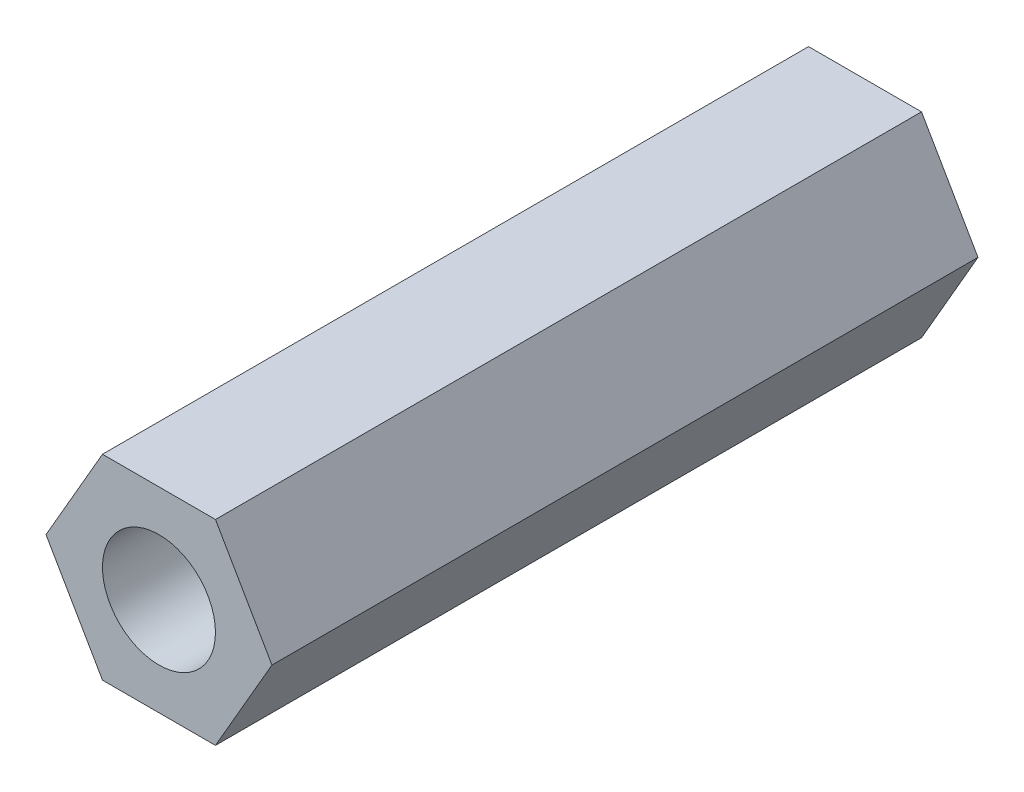
ISO-10303-21;
HEADER;
FILE_DESCRIPTION(('STEP AP214'),'2;1');
FILE_NAME('part.step','',(''),(''),'','','');
FILE_SCHEMA(('AUTOMOTIVE_DESIGN { 1 0 10303 214 1 1 1 1 }'));
ENDSEC;
DATA;
#1=APPLICATION_CONTEXT('core data for automotive mechanical design processes');
#2=APPLICATION_PROTOCOL_DEFINITION('international standard','automotive_design',2000,#1);
#3=PRODUCT_CONTEXT('',#1,'mechanical');
#4=PRODUCT('Part','Part','',(#3));
#5=PRODUCT_RELATED_PRODUCT_CATEGORY('part','',(#4));
#6=PRODUCT_DEFINITION_FORMATION('','',#4);
#7=PRODUCT_DEFINITION_CONTEXT('part definition',#1,'design');
#8=PRODUCT_DEFINITION('design','',#6,#7);
#9=PRODUCT_DEFINITION_SHAPE('','',#8);
#10=(LENGTH_UNIT() NAMED_UNIT(*) SI_UNIT(.MILLI.,.METRE.));
#11=(NAMED_UNIT(*) PLANE_ANGLE_UNIT() SI_UNIT($,.RADIAN.));
#12=(NAMED_UNIT(*) SI_UNIT($,.STERADIAN.) SOLID_ANGLE_UNIT());
#13=UNCERTAINTY_MEASURE_WITH_UNIT(LENGTH_MEASURE(1.E-05),#10,'distance_accuracy_value','');
#14=(GEOMETRIC_REPRESENTATION_CONTEXT(3) GLOBAL_UNCERTAINTY_ASSIGNED_CONTEXT((#13)) GLOBAL_UNIT_ASSIGNED_CONTEXT((#10,
#11,#12)) REPRESENTATION_CONTEXT('',''));
#15=CARTESIAN_POINT('',(0.,0.,0.));
#16=DIRECTION('',(0.,0.,1.));
#17=DIRECTION('',(1.,0.,0.));
#18=AXIS2_PLACEMENT_3D('',#15,#16,#17);
#19=CARTESIAN_POINT('',(0.,0.,25.));
#20=DIRECTION('',(0.,0.,1.));
#21=DIRECTION('',(1.,0.,0.));
#22=AXIS2_PLACEMENT_3D('',#19,#20,#21);
#23=PLANE('',#22);
#24=DIRECTION('',(0.499999999999994,0.866025403784442,0.));
#25=VECTOR('',#24,1.);
#26=CARTESIAN_POINT('',(47.1306074453142,75.903097182219,25.));
#27=LINE('',#26,#25);
#28=CARTESIAN_POINT('',(47.1306074453142,75.903097182219,25.));
#29=VERTEX_POINT('',#28);
#30=CARTESIAN_POINT('',(49.1306074453142,79.3671987973568,25.));
#31=VERTEX_POINT('',#30);
#32=EDGE_CURVE('E131',#29,#31,#27,.T.);
#33=ORIENTED_EDGE('',*,*,#32,.T.);
#34=DIRECTION('',(-0.499999999999999,0.866025403784439,0.));
#35=VECTOR('',#34,1.);
#36=CARTESIAN_POINT('',(49.1306074453142,79.3671987973568,25.));
#37=LINE('',#36,#35);
#38=CARTESIAN_POINT('',(47.1306074453142,82.8313004124945,25.));
#39=VERTEX_POINT('',#38);
#40=EDGE_CURVE('E89',#31,#39,#37,.T.);
#41=ORIENTED_EDGE('',*,*,#40,.T.);
#42=DIRECTION('',(-1.,0.,0.));
#43=VECTOR('',#42,1.);
#44=CARTESIAN_POINT('',(47.1306074453142,82.8313004124945,25.));
#45=LINE('',#44,#43);
#46=CARTESIAN_POINT('',(43.1306074453142,82.8313004124945,25.));
#47=VERTEX_POINT('',#46);
#48=EDGE_CURVE('E102',#39,#47,#45,.T.);
#49=ORIENTED_EDGE('',*,*,#48,.T.);
#50=DIRECTION('',(-0.5,-0.866025403784438,0.));
#51=VECTOR('',#50,1.);
#52=CARTESIAN_POINT('',(43.1306074453142,82.8313004124945,25.));
#53=LINE('',#52,#51);
#54=CARTESIAN_POINT('',(41.1306074453142,79.3671987973568,25.));
#55=VERTEX_POINT('',#54);
#56=EDGE_CURVE('E96',#47,#55,#53,.T.);
#57=ORIENTED_EDGE('',*,*,#56,.T.);
#58=DIRECTION('',(0.5,-0.866025403784438,0.));
#59=VECTOR('',#58,1.);
#60=CARTESIAN_POINT('',(41.1306074453142,79.3671987973568,25.));
#61=LINE('',#60,#59);
#62=CARTESIAN_POINT('',(43.1306074453142,75.903097182219,25.));
#63=VERTEX_POINT('',#62);
#64=EDGE_CURVE('E100',#55,#63,#61,.T.);
#65=ORIENTED_EDGE('',*,*,#64,.T.);
#66=DIRECTION('',(1.,0.,0.));
#67=VECTOR('',#66,1.);
#68=CARTESIAN_POINT('',(43.1306074453142,75.903097182219,25.));
#69=LINE('',#68,#67);
#70=EDGE_CURVE('E52',#63,#29,#69,.T.);
#71=ORIENTED_EDGE('',*,*,#70,.T.);
#72=EDGE_LOOP('',(#33,#41,#49,#57,#65,#71));
#73=FACE_BOUND('',#72,.T.);
#74=CARTESIAN_POINT('',(45.1306074453142,79.3671987973568,25.));
#75=DIRECTION('',(0.,0.,1.));
#76=DIRECTION('',(1.,0.,0.));
#77=AXIS2_PLACEMENT_3D('',#74,#75,#76);
#78=CIRCLE('',#77,2.);
#79=CARTESIAN_POINT('',(47.1306074453142,79.3671987973568,25.));
#80=VERTEX_POINT('',#79);
#81=EDGE_CURVE('E124',#80,#80,#78,.T.);
#82=ORIENTED_EDGE('',*,*,#81,.F.);
#83=EDGE_LOOP('',(#82));
#84=FACE_BOUND('',#83,.T.);
#85=ADVANCED_FACE('F35',(#73,#84),#23,.T.);
#86=CARTESIAN_POINT('',(0.,0.,0.));
#87=DIRECTION('',(0.,0.,1.));
#88=DIRECTION('',(1.,0.,0.));
#89=AXIS2_PLACEMENT_3D('',#86,#87,#88);
#90=PLANE('',#89);
#91=DIRECTION('',(0.499999999999994,0.866025403784442,0.));
#92=VECTOR('',#91,1.);
#93=CARTESIAN_POINT('',(47.1306074453142,75.903097182219,0.));
#94=LINE('',#93,#92);
#95=CARTESIAN_POINT('',(47.1306074453142,75.903097182219,0.));
#96=VERTEX_POINT('',#95);
#97=CARTESIAN_POINT('',(49.1306074453142,79.3671987973568,0.));
#98=VERTEX_POINT('',#97);
#99=EDGE_CURVE('E120',#96,#98,#94,.T.);
#100=ORIENTED_EDGE('',*,*,#99,.F.);
#101=DIRECTION('',(1.,0.,0.));
#102=VECTOR('',#101,1.);
#103=CARTESIAN_POINT('',(43.1306074453142,75.903097182219,0.));
#104=LINE('',#103,#102);
#105=CARTESIAN_POINT('',(43.1306074453142,75.903097182219,0.));
#106=VERTEX_POINT('',#105);
#107=EDGE_CURVE('E81',#106,#96,#104,.T.);
#108=ORIENTED_EDGE('',*,*,#107,.F.);
#109=DIRECTION('',(0.5,-0.866025403784438,0.));
#110=VECTOR('',#109,1.);
#111=CARTESIAN_POINT('',(41.1306074453142,79.3671987973568,0.));
#112=LINE('',#111,#110);
#113=CARTESIAN_POINT('',(41.1306074453142,79.3671987973568,0.));
#114=VERTEX_POINT('',#113);
#115=EDGE_CURVE('E75',#114,#106,#112,.T.);
#116=ORIENTED_EDGE('',*,*,#115,.F.);
#117=DIRECTION('',(-0.5,-0.866025403784438,0.));
#118=VECTOR('',#117,1.);
#119=CARTESIAN_POINT('',(43.1306074453142,82.8313004124945,0.));
#120=LINE('',#119,#118);
#121=CARTESIAN_POINT('',(43.1306074453142,82.8313004124945,0.));
#122=VERTEX_POINT('',#121);
#123=EDGE_CURVE('E110',#122,#114,#120,.T.);
#124=ORIENTED_EDGE('',*,*,#123,.F.);
#125=DIRECTION('',(-1.,0.,0.));
#126=VECTOR('',#125,1.);
#127=CARTESIAN_POINT('',(47.1306074453142,82.8313004124945,0.));
#128=LINE('',#127,#126);
#129=CARTESIAN_POINT('',(47.1306074453142,82.8313004124945,0.));
#130=VERTEX_POINT('',#129);
#131=EDGE_CURVE('E126',#130,#122,#128,.T.);
#132=ORIENTED_EDGE('',*,*,#131,.F.);
#133=DIRECTION('',(-0.499999999999999,0.866025403784439,0.));
#134=VECTOR('',#133,1.);
#135=CARTESIAN_POINT('',(49.1306074453142,79.3671987973568,0.));
#136=LINE('',#135,#134);
#137=EDGE_CURVE('E123',#98,#130,#136,.T.);
#138=ORIENTED_EDGE('',*,*,#137,.F.);
#139=EDGE_LOOP('',(#100,#108,#116,#124,#132,#138));
#140=FACE_BOUND('',#139,.T.);
#141=CARTESIAN_POINT('',(45.1306074453142,79.3671987973568,0.));
#142=DIRECTION('',(0.,0.,1.));
#143=DIRECTION('',(1.,0.,0.));
#144=AXIS2_PLACEMENT_3D('',#141,#142,#143);
#145=CIRCLE('',#144,2.);
#146=CARTESIAN_POINT('',(47.1306074453142,79.3671987973568,0.));
#147=VERTEX_POINT('',#146);
#148=EDGE_CURVE('E224',#147,#147,#145,.T.);
#149=ORIENTED_EDGE('',*,*,#148,.T.);
#150=EDGE_LOOP('',(#149));
#151=FACE_BOUND('',#150,.T.);
#152=ADVANCED_FACE('F140',(#140,#151),#90,.F.);
#153=CARTESIAN_POINT('',(47.1306074453142,75.903097182219,25.));
#154=DIRECTION('',(-0.866025403784442,0.499999999999994,0.));
#155=DIRECTION('',(-0.499999999999994,-0.866025403784442,0.));
#156=AXIS2_PLACEMENT_3D('',#153,#154,#155);
#157=PLANE('',#156);
#158=ORIENTED_EDGE('',*,*,#99,.T.);
#159=DIRECTION('',(0.,0.,-1.));
#160=VECTOR('',#159,1.);
#161=CARTESIAN_POINT('',(49.1306074453142,79.3671987973568,25.));
#162=LINE('',#161,#160);
#163=EDGE_CURVE('E11',#31,#98,#162,.T.);
#164=ORIENTED_EDGE('',*,*,#163,.F.);
#165=ORIENTED_EDGE('',*,*,#32,.F.);
#166=DIRECTION('',(0.,0.,-1.));
#167=VECTOR('',#166,1.);
#168=CARTESIAN_POINT('',(47.1306074453142,75.903097182219,25.));
#169=LINE('',#168,#167);
#170=EDGE_CURVE('E116',#29,#96,#169,.T.);
#171=ORIENTED_EDGE('',*,*,#170,.T.);
#172=EDGE_LOOP('',(#158,#164,#165,#171));
#173=FACE_BOUND('',#172,.T.);
#174=ADVANCED_FACE('F37',(#173),#157,.F.);
#175=CARTESIAN_POINT('',(49.1306074453142,79.3671987973568,25.));
#176=DIRECTION('',(-0.866025403784439,-0.499999999999999,0.));
#177=DIRECTION('',(0.499999999999999,-0.866025403784439,0.));
#178=AXIS2_PLACEMENT_3D('',#175,#176,#177);
#179=PLANE('',#178);
#180=ORIENTED_EDGE('',*,*,#137,.T.);
#181=DIRECTION('',(0.,0.,-1.));
#182=VECTOR('',#181,1.);
#183=CARTESIAN_POINT('',(47.1306074453142,82.8313004124945,25.));
#184=LINE('',#183,#182);
#185=EDGE_CURVE('E44',#39,#130,#184,.T.);
#186=ORIENTED_EDGE('',*,*,#185,.F.);
#187=ORIENTED_EDGE('',*,*,#40,.F.);
#188=ORIENTED_EDGE('',*,*,#163,.T.);
#189=EDGE_LOOP('',(#180,#186,#187,#188));
#190=FACE_BOUND('',#189,.T.);
#191=ADVANCED_FACE('F165',(#190),#179,.F.);
#192=CARTESIAN_POINT('',(47.1306074453142,82.8313004124945,25.));
#193=DIRECTION('',(0.,-1.,0.));
#194=DIRECTION('',(1.,0.,0.));
#195=AXIS2_PLACEMENT_3D('',#192,#193,#194);
#196=PLANE('',#195);
#197=ORIENTED_EDGE('',*,*,#131,.T.);
#198=DIRECTION('',(0.,0.,-1.));
#199=VECTOR('',#198,1.);
#200=CARTESIAN_POINT('',(43.1306074453142,82.8313004124945,25.));
#201=LINE('',#200,#199);
#202=EDGE_CURVE('E111',#47,#122,#201,.T.);
#203=ORIENTED_EDGE('',*,*,#202,.F.);
#204=ORIENTED_EDGE('',*,*,#48,.F.);
#205=ORIENTED_EDGE('',*,*,#185,.T.);
#206=EDGE_LOOP('',(#197,#203,#204,#205));
#207=FACE_BOUND('',#206,.T.);
#208=ADVANCED_FACE('F137',(#207),#196,.F.);
#209=CARTESIAN_POINT('',(43.1306074453142,82.8313004124945,25.));
#210=DIRECTION('',(0.866025403784439,-0.5,0.));
#211=DIRECTION('',(0.5,0.866025403784439,0.));
#212=AXIS2_PLACEMENT_3D('',#209,#210,#211);
#213=PLANE('',#212);
#214=ORIENTED_EDGE('',*,*,#123,.T.);
#215=DIRECTION('',(0.,0.,-1.));
#216=VECTOR('',#215,1.);
#217=CARTESIAN_POINT('',(41.1306074453142,79.3671987973568,25.));
#218=LINE('',#217,#216);
#219=EDGE_CURVE('E107',#55,#114,#218,.T.);
#220=ORIENTED_EDGE('',*,*,#219,.F.);
#221=ORIENTED_EDGE('',*,*,#56,.F.);
#222=ORIENTED_EDGE('',*,*,#202,.T.);
#223=EDGE_LOOP('',(#214,#220,#221,#222));
#224=FACE_BOUND('',#223,.T.);
#225=ADVANCED_FACE('F108',(#224),#213,.F.);
#226=CARTESIAN_POINT('',(41.1306074453142,79.3671987973568,25.));
#227=DIRECTION('',(0.866025403784439,0.5,0.));
#228=DIRECTION('',(-0.5,0.866025403784439,0.));
#229=AXIS2_PLACEMENT_3D('',#226,#227,#228);
#230=PLANE('',#229);
#231=ORIENTED_EDGE('',*,*,#115,.T.);
#232=DIRECTION('',(0.,0.,-1.));
#233=VECTOR('',#232,1.);
#234=CARTESIAN_POINT('',(43.1306074453142,75.903097182219,25.));
#235=LINE('',#234,#233);
#236=EDGE_CURVE('E112',#63,#106,#235,.T.);
#237=ORIENTED_EDGE('',*,*,#236,.F.);
#238=ORIENTED_EDGE('',*,*,#64,.F.);
#239=ORIENTED_EDGE('',*,*,#219,.T.);
#240=EDGE_LOOP('',(#231,#237,#238,#239));
#241=FACE_BOUND('',#240,.T.);
#242=ADVANCED_FACE('F114',(#241),#230,.F.);
#243=CARTESIAN_POINT('',(43.1306074453142,75.903097182219,25.));
#244=DIRECTION('',(0.,1.,0.));
#245=DIRECTION('',(0.,0.,1.));
#246=AXIS2_PLACEMENT_3D('',#243,#244,#245);
#247=PLANE('',#246);
#248=ORIENTED_EDGE('',*,*,#107,.T.);
#249=ORIENTED_EDGE('',*,*,#170,.F.);
#250=ORIENTED_EDGE('',*,*,#70,.F.);
#251=ORIENTED_EDGE('',*,*,#236,.T.);
#252=EDGE_LOOP('',(#248,#249,#250,#251));
#253=FACE_BOUND('',#252,.T.);
#254=ADVANCED_FACE('F145',(#253),#247,.F.);
#255=CARTESIAN_POINT('',(45.1306074453142,79.3671987973568,25.));
#256=DIRECTION('',(0.,0.,-1.));
#257=DIRECTION('',(-1.,0.,0.));
#258=AXIS2_PLACEMENT_3D('',#255,#256,#257);
#259=CYLINDRICAL_SURFACE('',#258,2.);
#260=ORIENTED_EDGE('',*,*,#81,.T.);
#261=EDGE_LOOP('',(#260));
#262=FACE_BOUND('',#261,.T.);
#263=ORIENTED_EDGE('',*,*,#148,.F.);
#264=EDGE_LOOP('',(#263));
#265=FACE_BOUND('',#264,.T.);
#266=ADVANCED_FACE('F147',(#262,#265),#259,.F.);
#267=CLOSED_SHELL('',(#85,#152,#174,#191,#208,#225,#242,#254,#266));
#268=MANIFOLD_SOLID_BREP('B2',#267);
#269=ADVANCED_BREP_SHAPE_REPRESENTATION('',(#18,#268),#14);
#270=SHAPE_DEFINITION_REPRESENTATION(#9,#269);
ENDSEC;
END-ISO-10303-21;
